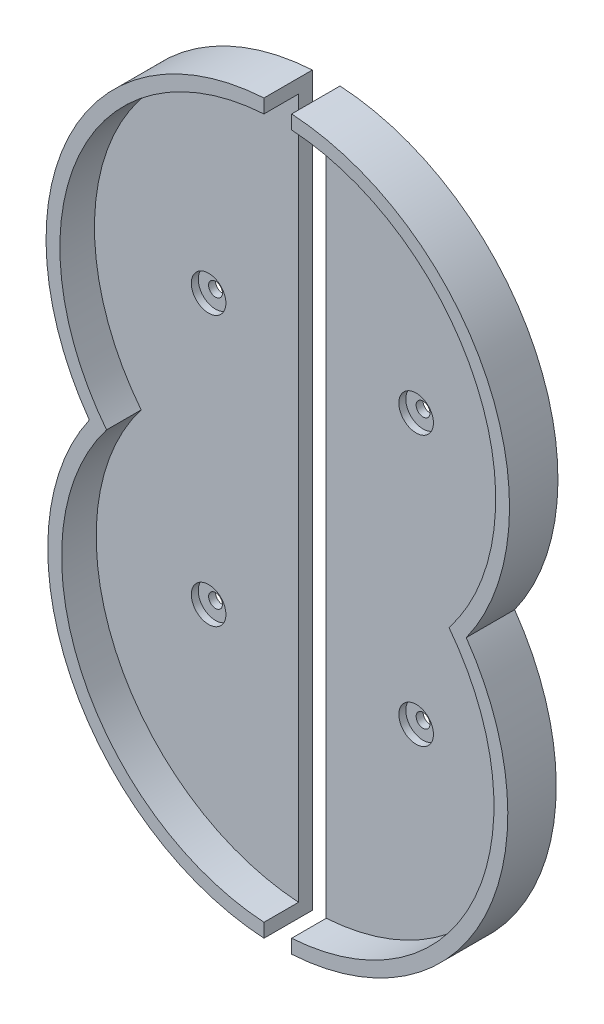
ISO-10303-21;
HEADER;
FILE_DESCRIPTION(('STEP AP214'),'2;1');
FILE_NAME('part.step','',(''),(''),'','','');
FILE_SCHEMA(('AUTOMOTIVE_DESIGN { 1 0 10303 214 1 1 1 1 }'));
ENDSEC;
DATA;
#1=APPLICATION_CONTEXT('core data for automotive mechanical design processes');
#2=APPLICATION_PROTOCOL_DEFINITION('international standard','automotive_design',2000,#1);
#3=PRODUCT_CONTEXT('',#1,'mechanical');
#4=PRODUCT('Part','Part','',(#3));
#5=PRODUCT_RELATED_PRODUCT_CATEGORY('part','',(#4));
#6=PRODUCT_DEFINITION_FORMATION('','',#4);
#7=PRODUCT_DEFINITION_CONTEXT('part definition',#1,'design');
#8=PRODUCT_DEFINITION('design','',#6,#7);
#9=PRODUCT_DEFINITION_SHAPE('','',#8);
#10=(LENGTH_UNIT() NAMED_UNIT(*) SI_UNIT(.MILLI.,.METRE.));
#11=(NAMED_UNIT(*) PLANE_ANGLE_UNIT() SI_UNIT($,.RADIAN.));
#12=(NAMED_UNIT(*) SI_UNIT($,.STERADIAN.) SOLID_ANGLE_UNIT());
#13=UNCERTAINTY_MEASURE_WITH_UNIT(LENGTH_MEASURE(1.E-05),#10,'distance_accuracy_value','');
#14=(GEOMETRIC_REPRESENTATION_CONTEXT(3) GLOBAL_UNCERTAINTY_ASSIGNED_CONTEXT((#13)) GLOBAL_UNIT_ASSIGNED_CONTEXT((#10,
#11,#12)) REPRESENTATION_CONTEXT('',''));
#15=CARTESIAN_POINT('',(0.,0.,0.));
#16=DIRECTION('',(0.,0.,1.));
#17=DIRECTION('',(1.,0.,0.));
#18=AXIS2_PLACEMENT_3D('',#15,#16,#17);
#19=CARTESIAN_POINT('',(30.,-77.9422863405995,2.));
#20=DIRECTION('',(0.,0.,-1.));
#21=DIRECTION('',(-1.,0.,0.));
#22=AXIS2_PLACEMENT_3D('',#19,#20,#21);
#23=CYLINDRICAL_SURFACE('',#22,2.);
#24=CARTESIAN_POINT('',(30.,-77.9422863405995,2.));
#25=DIRECTION('',(0.,0.,1.));
#26=DIRECTION('',(1.,0.,0.));
#27=AXIS2_PLACEMENT_3D('',#24,#25,#26);
#28=CIRCLE('',#27,2.);
#29=CARTESIAN_POINT('',(32.,-77.9422863405995,2.));
#30=VERTEX_POINT('',#29);
#31=EDGE_CURVE('E12',#30,#30,#28,.T.);
#32=ORIENTED_EDGE('',*,*,#31,.T.);
#33=EDGE_LOOP('',(#32));
#34=FACE_BOUND('',#33,.T.);
#35=CARTESIAN_POINT('',(30.,-77.9422863405995,0.));
#36=DIRECTION('',(0.,0.,1.));
#37=DIRECTION('',(1.,0.,0.));
#38=AXIS2_PLACEMENT_3D('',#35,#36,#37);
#39=CIRCLE('',#38,2.);
#40=CARTESIAN_POINT('',(32.,-77.9422863405995,0.));
#41=VERTEX_POINT('',#40);
#42=EDGE_CURVE('E52',#41,#41,#39,.T.);
#43=ORIENTED_EDGE('',*,*,#42,.F.);
#44=EDGE_LOOP('',(#43));
#45=FACE_BOUND('',#44,.T.);
#46=ADVANCED_FACE('F49',(#34,#45),#23,.F.);
#47=CARTESIAN_POINT('',(0.,0.,2.));
#48=DIRECTION('',(0.,0.,1.));
#49=DIRECTION('',(1.,0.,0.));
#50=AXIS2_PLACEMENT_3D('',#47,#48,#49);
#51=PLANE('',#50);
#52=ORIENTED_EDGE('',*,*,#31,.F.);
#53=EDGE_LOOP('',(#52));
#54=FACE_BOUND('',#53,.T.);
#55=CARTESIAN_POINT('',(30.,-77.9422863405995,2.));
#56=DIRECTION('',(0.,0.,1.));
#57=DIRECTION('',(1.,0.,0.));
#58=AXIS2_PLACEMENT_3D('',#55,#56,#57);
#59=CIRCLE('',#58,5.);
#60=CARTESIAN_POINT('',(35.,-77.9422863405995,2.));
#61=VERTEX_POINT('',#60);
#62=EDGE_CURVE('E165',#61,#61,#59,.F.);
#63=ORIENTED_EDGE('',*,*,#62,.F.);
#64=EDGE_LOOP('',(#63));
#65=FACE_BOUND('',#64,.T.);
#66=ADVANCED_FACE('F177',(#54,#65),#51,.T.);
#67=CARTESIAN_POINT('',(0.,0.,0.));
#68=DIRECTION('',(0.,0.,1.));
#69=DIRECTION('',(1.,0.,0.));
#70=AXIS2_PLACEMENT_3D('',#67,#68,#69);
#71=PLANE('',#70);
#72=DIRECTION('',(0.,-1.,0.));
#73=VECTOR('',#72,1.);
#74=CARTESIAN_POINT('',(3.99999999999997,0.,0.));
#75=LINE('',#74,#73);
#76=CARTESIAN_POINT('',(3.99999999999996,66.8804904288239,0.));
#77=VERTEX_POINT('',#76);
#78=CARTESIAN_POINT('',(4.00000000000001,-143.510733407058,0.));
#79=VERTEX_POINT('',#78);
#80=EDGE_CURVE('E132',#77,#79,#75,.T.);
#81=ORIENTED_EDGE('',*,*,#80,.F.);
#82=CARTESIAN_POINT('',(0.,0.,0.));
#83=DIRECTION('',(0.,0.,1.));
#84=DIRECTION('',(1.,0.,0.));
#85=AXIS2_PLACEMENT_3D('',#82,#83,#84);
#86=CIRCLE('',#85,67.);
#87=CARTESIAN_POINT('',(54.4805878735252,-38.9982761792761,0.));
#88=VERTEX_POINT('',#87);
#89=EDGE_CURVE('E127',#88,#77,#86,.T.);
#90=ORIENTED_EDGE('',*,*,#89,.F.);
#91=CARTESIAN_POINT('',(0.,-77.1311431702997,0.));
#92=DIRECTION('',(0.,0.,1.));
#93=DIRECTION('',(1.,0.,0.));
#94=AXIS2_PLACEMENT_3D('',#91,#92,#93);
#95=CIRCLE('',#94,66.5);
#96=EDGE_CURVE('E388',#79,#88,#95,.T.);
#97=ORIENTED_EDGE('',*,*,#96,.F.);
#98=EDGE_LOOP('',(#81,#90,#97));
#99=FACE_BOUND('',#98,.T.);
#100=ORIENTED_EDGE('',*,*,#42,.T.);
#101=EDGE_LOOP('',(#100));
#102=FACE_BOUND('',#101,.T.);
#103=CARTESIAN_POINT('',(30.,0.,0.));
#104=DIRECTION('',(0.,0.,1.));
#105=DIRECTION('',(1.,0.,0.));
#106=AXIS2_PLACEMENT_3D('',#103,#104,#105);
#107=CIRCLE('',#106,2.);
#108=CARTESIAN_POINT('',(32.,0.,0.));
#109=VERTEX_POINT('',#108);
#110=EDGE_CURVE('E134',#109,#109,#107,.F.);
#111=ORIENTED_EDGE('',*,*,#110,.F.);
#112=EDGE_LOOP('',(#111));
#113=FACE_BOUND('',#112,.T.);
#114=ADVANCED_FACE('F173',(#99,#102,#113),#71,.F.);
#115=CARTESIAN_POINT('',(3.99999999999997,0.,4.));
#116=DIRECTION('',(1.,0.,0.));
#117=DIRECTION('',(0.,1.,0.));
#118=AXIS2_PLACEMENT_3D('',#115,#116,#117);
#119=PLANE('',#118);
#120=ORIENTED_EDGE('',*,*,#80,.T.);
#121=DIRECTION('',(0.,0.,-1.));
#122=VECTOR('',#121,1.);
#123=CARTESIAN_POINT('',(4.00000000000001,-143.510733407058,14.));
#124=LINE('',#123,#122);
#125=CARTESIAN_POINT('',(4.00000000000001,-143.510733407058,14.));
#126=VERTEX_POINT('',#125);
#127=EDGE_CURVE('E112',#126,#79,#124,.T.);
#128=ORIENTED_EDGE('',*,*,#127,.F.);
#129=DIRECTION('',(0.,-1.,0.));
#130=VECTOR('',#129,1.);
#131=CARTESIAN_POINT('',(3.99999999999997,0.,14.));
#132=LINE('',#131,#130);
#133=CARTESIAN_POINT('',(4.00000000000001,-139.503011829175,14.));
#134=VERTEX_POINT('',#133);
#135=EDGE_CURVE('E118',#134,#126,#132,.T.);
#136=ORIENTED_EDGE('',*,*,#135,.F.);
#137=DIRECTION('',(0.,0.,-1.));
#138=VECTOR('',#137,1.);
#139=CARTESIAN_POINT('',(4.00000000000001,-139.503011829175,14.));
#140=LINE('',#139,#138);
#141=CARTESIAN_POINT('',(4.00000000000001,-139.503011829175,4.));
#142=VERTEX_POINT('',#141);
#143=EDGE_CURVE('E377',#134,#142,#140,.T.);
#144=ORIENTED_EDGE('',*,*,#143,.T.);
#145=DIRECTION('',(0.,-1.,0.));
#146=VECTOR('',#145,1.);
#147=CARTESIAN_POINT('',(3.99999999999997,0.,4.));
#148=LINE('',#147,#146);
#149=CARTESIAN_POINT('',(3.99999999999996,62.8728876384726,4.));
#150=VERTEX_POINT('',#149);
#151=EDGE_CURVE('E153',#150,#142,#148,.T.);
#152=ORIENTED_EDGE('',*,*,#151,.F.);
#153=DIRECTION('',(0.,0.,-1.));
#154=VECTOR('',#153,1.);
#155=CARTESIAN_POINT('',(3.99999999999996,62.8728876384726,14.));
#156=LINE('',#155,#154);
#157=CARTESIAN_POINT('',(3.99999999999996,62.8728876384726,14.));
#158=VERTEX_POINT('',#157);
#159=EDGE_CURVE('E71',#158,#150,#156,.T.);
#160=ORIENTED_EDGE('',*,*,#159,.F.);
#161=CARTESIAN_POINT('',(3.99999999999996,66.8804904288239,14.));
#162=VERTEX_POINT('',#161);
#163=EDGE_CURVE('E129',#162,#158,#132,.T.);
#164=ORIENTED_EDGE('',*,*,#163,.F.);
#165=DIRECTION('',(0.,0.,-1.));
#166=VECTOR('',#165,1.);
#167=CARTESIAN_POINT('',(3.99999999999996,66.8804904288239,14.));
#168=LINE('',#167,#166);
#169=EDGE_CURVE('E139',#162,#77,#168,.T.);
#170=ORIENTED_EDGE('',*,*,#169,.T.);
#171=EDGE_LOOP('',(#120,#128,#136,#144,#152,#160,#164,#170));
#172=FACE_BOUND('',#171,.T.);
#173=ADVANCED_FACE('F130',(#172),#119,.F.);
#174=CARTESIAN_POINT('',(30.,0.,4.));
#175=DIRECTION('',(0.,0.,-1.));
#176=DIRECTION('',(-1.,0.,0.));
#177=AXIS2_PLACEMENT_3D('',#174,#175,#176);
#178=CYLINDRICAL_SURFACE('',#177,5.);
#179=CARTESIAN_POINT('',(30.,0.,2.));
#180=DIRECTION('',(0.,0.,1.));
#181=DIRECTION('',(1.,0.,0.));
#182=AXIS2_PLACEMENT_3D('',#179,#180,#181);
#183=CIRCLE('',#182,5.);
#184=CARTESIAN_POINT('',(35.,0.,2.));
#185=VERTEX_POINT('',#184);
#186=EDGE_CURVE('E137',#185,#185,#183,.F.);
#187=ORIENTED_EDGE('',*,*,#186,.T.);
#188=EDGE_LOOP('',(#187));
#189=FACE_BOUND('',#188,.T.);
#190=CARTESIAN_POINT('',(30.,0.,4.));
#191=DIRECTION('',(0.,0.,1.));
#192=DIRECTION('',(1.,0.,0.));
#193=AXIS2_PLACEMENT_3D('',#190,#191,#192);
#194=CIRCLE('',#193,5.);
#195=CARTESIAN_POINT('',(35.,0.,4.));
#196=VERTEX_POINT('',#195);
#197=EDGE_CURVE('E159',#196,#196,#194,.F.);
#198=ORIENTED_EDGE('',*,*,#197,.F.);
#199=EDGE_LOOP('',(#198));
#200=FACE_BOUND('',#199,.T.);
#201=ADVANCED_FACE('F193',(#189,#200),#178,.F.);
#202=CARTESIAN_POINT('',(30.,-77.9422863405995,4.));
#203=DIRECTION('',(0.,0.,-1.));
#204=DIRECTION('',(-1.,0.,0.));
#205=AXIS2_PLACEMENT_3D('',#202,#203,#204);
#206=CYLINDRICAL_SURFACE('',#205,5.);
#207=ORIENTED_EDGE('',*,*,#62,.T.);
#208=EDGE_LOOP('',(#207));
#209=FACE_BOUND('',#208,.T.);
#210=CARTESIAN_POINT('',(30.,-77.9422863405995,4.));
#211=DIRECTION('',(0.,0.,1.));
#212=DIRECTION('',(1.,0.,0.));
#213=AXIS2_PLACEMENT_3D('',#210,#211,#212);
#214=CIRCLE('',#213,5.);
#215=CARTESIAN_POINT('',(35.,-77.9422863405995,4.));
#216=VERTEX_POINT('',#215);
#217=EDGE_CURVE('E162',#216,#216,#214,.T.);
#218=ORIENTED_EDGE('',*,*,#217,.T.);
#219=EDGE_LOOP('',(#218));
#220=FACE_BOUND('',#219,.T.);
#221=ADVANCED_FACE('F196',(#209,#220),#206,.F.);
#222=CARTESIAN_POINT('',(0.,0.,4.));
#223=DIRECTION('',(0.,0.,1.));
#224=DIRECTION('',(1.,0.,0.));
#225=AXIS2_PLACEMENT_3D('',#222,#223,#224);
#226=PLANE('',#225);
#227=DIRECTION('',(1.,3.7011718080398E-12,0.));
#228=VECTOR('',#227,1.);
#229=CARTESIAN_POINT('',(1.44238896429674E-10,-38.971143170483,4.));
#230=LINE('',#229,#228);
#231=CARTESIAN_POINT('',(49.4981252170221,-38.9711431702998,4.));
#232=VERTEX_POINT('',#231);
#233=CARTESIAN_POINT('',(49.5,-38.9711431702997,4.));
#234=VERTEX_POINT('',#233);
#235=EDGE_CURVE('E148',#232,#234,#230,.T.);
#236=ORIENTED_EDGE('',*,*,#235,.T.);
#237=CARTESIAN_POINT('',(0.,0.,4.));
#238=DIRECTION('',(0.,0.,1.));
#239=DIRECTION('',(1.,0.,0.));
#240=AXIS2_PLACEMENT_3D('',#237,#238,#239);
#241=CIRCLE('',#240,63.);
#242=EDGE_CURVE('E151',#234,#150,#241,.T.);
#243=ORIENTED_EDGE('',*,*,#242,.T.);
#244=ORIENTED_EDGE('',*,*,#151,.T.);
#245=CARTESIAN_POINT('',(0.,-77.1311431702997,4.));
#246=DIRECTION('',(0.,0.,1.));
#247=DIRECTION('',(1.,0.,0.));
#248=AXIS2_PLACEMENT_3D('',#245,#246,#247);
#249=CIRCLE('',#248,62.5);
#250=EDGE_CURVE('E156',#142,#232,#249,.T.);
#251=ORIENTED_EDGE('',*,*,#250,.T.);
#252=EDGE_LOOP('',(#236,#243,#244,#251));
#253=FACE_BOUND('',#252,.T.);
#254=ORIENTED_EDGE('',*,*,#197,.T.);
#255=EDGE_LOOP('',(#254));
#256=FACE_BOUND('',#255,.T.);
#257=ORIENTED_EDGE('',*,*,#217,.F.);
#258=EDGE_LOOP('',(#257));
#259=FACE_BOUND('',#258,.T.);
#260=ADVANCED_FACE('F200',(#253,#256,#259),#226,.T.);
#261=CARTESIAN_POINT('',(30.,0.,2.));
#262=DIRECTION('',(0.,0.,-1.));
#263=DIRECTION('',(-1.,0.,0.));
#264=AXIS2_PLACEMENT_3D('',#261,#262,#263);
#265=CYLINDRICAL_SURFACE('',#264,2.);
#266=CARTESIAN_POINT('',(30.,0.,2.));
#267=DIRECTION('',(0.,0.,1.));
#268=DIRECTION('',(1.,0.,0.));
#269=AXIS2_PLACEMENT_3D('',#266,#267,#268);
#270=CIRCLE('',#269,2.);
#271=CARTESIAN_POINT('',(32.,0.,2.));
#272=VERTEX_POINT('',#271);
#273=EDGE_CURVE('E145',#272,#272,#270,.F.);
#274=ORIENTED_EDGE('',*,*,#273,.F.);
#275=EDGE_LOOP('',(#274));
#276=FACE_BOUND('',#275,.T.);
#277=ORIENTED_EDGE('',*,*,#110,.T.);
#278=EDGE_LOOP('',(#277));
#279=FACE_BOUND('',#278,.T.);
#280=ADVANCED_FACE('F203',(#276,#279),#265,.F.);
#281=CARTESIAN_POINT('',(0.,0.,2.));
#282=DIRECTION('',(0.,0.,1.));
#283=DIRECTION('',(1.,0.,0.));
#284=AXIS2_PLACEMENT_3D('',#281,#282,#283);
#285=PLANE('',#284);
#286=ORIENTED_EDGE('',*,*,#186,.F.);
#287=EDGE_LOOP('',(#286));
#288=FACE_BOUND('',#287,.T.);
#289=ORIENTED_EDGE('',*,*,#273,.T.);
#290=EDGE_LOOP('',(#289));
#291=FACE_BOUND('',#290,.T.);
#292=ADVANCED_FACE('F207',(#288,#291),#285,.T.);
#293=CARTESIAN_POINT('',(0.,-77.1311431702997,14.));
#294=DIRECTION('',(0.,0.,-1.));
#295=DIRECTION('',(-1.,0.,0.));
#296=AXIS2_PLACEMENT_3D('',#293,#294,#295);
#297=CYLINDRICAL_SURFACE('',#296,66.5);
#298=ORIENTED_EDGE('',*,*,#96,.T.);
#299=DIRECTION('',(0.,0.,-1.));
#300=VECTOR('',#299,1.);
#301=CARTESIAN_POINT('',(54.4805878735252,-38.9982761792761,14.));
#302=LINE('',#301,#300);
#303=CARTESIAN_POINT('',(54.4805878735252,-38.9982761792761,14.));
#304=VERTEX_POINT('',#303);
#305=EDGE_CURVE('E114',#304,#88,#302,.T.);
#306=ORIENTED_EDGE('',*,*,#305,.F.);
#307=CARTESIAN_POINT('',(0.,-77.1311431702997,14.));
#308=DIRECTION('',(0.,0.,1.));
#309=DIRECTION('',(1.,0.,0.));
#310=AXIS2_PLACEMENT_3D('',#307,#308,#309);
#311=CIRCLE('',#310,66.5);
#312=EDGE_CURVE('E108',#126,#304,#311,.T.);
#313=ORIENTED_EDGE('',*,*,#312,.F.);
#314=ORIENTED_EDGE('',*,*,#127,.T.);
#315=EDGE_LOOP('',(#298,#306,#313,#314));
#316=FACE_BOUND('',#315,.T.);
#317=ADVANCED_FACE('F110',(#316),#297,.T.);
#318=CARTESIAN_POINT('',(0.,0.,14.));
#319=DIRECTION('',(0.,0.,-1.));
#320=DIRECTION('',(-1.,0.,0.));
#321=AXIS2_PLACEMENT_3D('',#318,#319,#320);
#322=CYLINDRICAL_SURFACE('',#321,67.);
#323=ORIENTED_EDGE('',*,*,#89,.T.);
#324=ORIENTED_EDGE('',*,*,#169,.F.);
#325=CARTESIAN_POINT('',(0.,0.,14.));
#326=DIRECTION('',(0.,0.,1.));
#327=DIRECTION('',(1.,0.,0.));
#328=AXIS2_PLACEMENT_3D('',#325,#326,#327);
#329=CIRCLE('',#328,67.);
#330=EDGE_CURVE('E117',#304,#162,#329,.T.);
#331=ORIENTED_EDGE('',*,*,#330,.F.);
#332=ORIENTED_EDGE('',*,*,#305,.T.);
#333=EDGE_LOOP('',(#323,#324,#331,#332));
#334=FACE_BOUND('',#333,.T.);
#335=ADVANCED_FACE('F214',(#334),#322,.T.);
#336=CARTESIAN_POINT('',(0.,0.,14.));
#337=DIRECTION('',(0.,0.,-1.));
#338=DIRECTION('',(-1.,0.,0.));
#339=AXIS2_PLACEMENT_3D('',#336,#337,#338);
#340=CYLINDRICAL_SURFACE('',#339,63.);
#341=ORIENTED_EDGE('',*,*,#159,.T.);
#342=ORIENTED_EDGE('',*,*,#242,.F.);
#343=DIRECTION('',(0.,0.,-1.));
#344=VECTOR('',#343,1.);
#345=CARTESIAN_POINT('',(49.5,-38.9711431702997,14.));
#346=LINE('',#345,#344);
#347=CARTESIAN_POINT('',(49.5,-38.9711431702997,14.));
#348=VERTEX_POINT('',#347);
#349=EDGE_CURVE('E371',#348,#234,#346,.T.);
#350=ORIENTED_EDGE('',*,*,#349,.F.);
#351=CARTESIAN_POINT('',(0.,0.,14.));
#352=DIRECTION('',(0.,0.,1.));
#353=DIRECTION('',(1.,0.,0.));
#354=AXIS2_PLACEMENT_3D('',#351,#352,#353);
#355=CIRCLE('',#354,63.);
#356=EDGE_CURVE('E391',#348,#158,#355,.T.);
#357=ORIENTED_EDGE('',*,*,#356,.T.);
#358=EDGE_LOOP('',(#341,#342,#350,#357));
#359=FACE_BOUND('',#358,.T.);
#360=ADVANCED_FACE('F217',(#359),#340,.F.);
#361=CARTESIAN_POINT('',(1.44238896429674E-10,-38.971143170483,14.));
#362=DIRECTION('',(-3.7011718080398E-12,1.,0.));
#363=DIRECTION('',(-1.,-3.7011718080398E-12,0.));
#364=AXIS2_PLACEMENT_3D('',#361,#362,#363);
#365=PLANE('',#364);
#366=ORIENTED_EDGE('',*,*,#349,.T.);
#367=ORIENTED_EDGE('',*,*,#235,.F.);
#368=DIRECTION('',(0.,0.,-1.));
#369=VECTOR('',#368,1.);
#370=CARTESIAN_POINT('',(49.4981252170221,-38.9711431702998,14.));
#371=LINE('',#370,#369);
#372=CARTESIAN_POINT('',(49.4981252170221,-38.9711431702998,14.));
#373=VERTEX_POINT('',#372);
#374=EDGE_CURVE('E63',#373,#232,#371,.T.);
#375=ORIENTED_EDGE('',*,*,#374,.F.);
#376=DIRECTION('',(1.,3.7011718080398E-12,0.));
#377=VECTOR('',#376,1.);
#378=CARTESIAN_POINT('',(1.44238896429674E-10,-38.971143170483,14.));
#379=LINE('',#378,#377);
#380=EDGE_CURVE('E372',#373,#348,#379,.T.);
#381=ORIENTED_EDGE('',*,*,#380,.T.);
#382=EDGE_LOOP('',(#366,#367,#375,#381));
#383=FACE_BOUND('',#382,.T.);
#384=ADVANCED_FACE('F221',(#383),#365,.T.);
#385=CARTESIAN_POINT('',(0.,-77.1311431702997,14.));
#386=DIRECTION('',(0.,0.,-1.));
#387=DIRECTION('',(-1.,0.,0.));
#388=AXIS2_PLACEMENT_3D('',#385,#386,#387);
#389=CYLINDRICAL_SURFACE('',#388,62.5);
#390=ORIENTED_EDGE('',*,*,#374,.T.);
#391=ORIENTED_EDGE('',*,*,#250,.F.);
#392=ORIENTED_EDGE('',*,*,#143,.F.);
#393=CARTESIAN_POINT('',(0.,-77.1311431702997,14.));
#394=DIRECTION('',(0.,0.,1.));
#395=DIRECTION('',(1.,0.,0.));
#396=AXIS2_PLACEMENT_3D('',#393,#394,#395);
#397=CIRCLE('',#396,62.5);
#398=EDGE_CURVE('E124',#134,#373,#397,.T.);
#399=ORIENTED_EDGE('',*,*,#398,.T.);
#400=EDGE_LOOP('',(#390,#391,#392,#399));
#401=FACE_BOUND('',#400,.T.);
#402=ADVANCED_FACE('F224',(#401),#389,.F.);
#403=CARTESIAN_POINT('',(0.,0.,14.));
#404=DIRECTION('',(0.,0.,1.));
#405=DIRECTION('',(1.,0.,0.));
#406=AXIS2_PLACEMENT_3D('',#403,#404,#405);
#407=PLANE('',#406);
#408=ORIENTED_EDGE('',*,*,#135,.T.);
#409=ORIENTED_EDGE('',*,*,#312,.T.);
#410=ORIENTED_EDGE('',*,*,#330,.T.);
#411=ORIENTED_EDGE('',*,*,#163,.T.);
#412=ORIENTED_EDGE('',*,*,#356,.F.);
#413=ORIENTED_EDGE('',*,*,#380,.F.);
#414=ORIENTED_EDGE('',*,*,#398,.F.);
#415=EDGE_LOOP('',(#408,#409,#410,#411,#412,#413,#414));
#416=FACE_BOUND('',#415,.T.);
#417=ADVANCED_FACE('F122',(#416),#407,.T.);
#418=CLOSED_SHELL('',(#46,#66,#114,#173,#201,#221,#260,#280,#292,#317,#335,#360,#384,#402,#417));
#419=MANIFOLD_SOLID_BREP('B2',#418);
#420=CARTESIAN_POINT('',(-3.99999999999999,0.,4.));
#421=DIRECTION('',(1.,0.,0.));
#422=DIRECTION('',(0.,0.,-1.));
#423=AXIS2_PLACEMENT_3D('',#420,#421,#422);
#424=PLANE('',#423);
#425=DIRECTION('',(0.,-1.,0.));
#426=VECTOR('',#425,1.);
#427=CARTESIAN_POINT('',(-3.99999999999999,0.,0.));
#428=LINE('',#427,#426);
#429=CARTESIAN_POINT('',(-3.99999999999999,66.8804904288239,0.));
#430=VERTEX_POINT('',#429);
#431=CARTESIAN_POINT('',(-3.99999999999999,-143.510733407058,0.));
#432=VERTEX_POINT('',#431);
#433=EDGE_CURVE('E509',#430,#432,#428,.T.);
#434=ORIENTED_EDGE('',*,*,#433,.F.);
#435=DIRECTION('',(0.,0.,-1.));
#436=VECTOR('',#435,1.);
#437=CARTESIAN_POINT('',(-3.99999999999999,66.8804904288239,14.));
#438=LINE('',#437,#436);
#439=CARTESIAN_POINT('',(-3.99999999999999,66.8804904288239,14.));
#440=VERTEX_POINT('',#439);
#441=EDGE_CURVE('E530',#440,#430,#438,.T.);
#442=ORIENTED_EDGE('',*,*,#441,.F.);
#443=DIRECTION('',(0.,-1.,0.));
#444=VECTOR('',#443,1.);
#445=CARTESIAN_POINT('',(-3.99999999999999,0.,14.));
#446=LINE('',#445,#444);
#447=CARTESIAN_POINT('',(-3.99999999999999,62.8728876384726,14.));
#448=VERTEX_POINT('',#447);
#449=EDGE_CURVE('E483',#440,#448,#446,.T.);
#450=ORIENTED_EDGE('',*,*,#449,.T.);
#451=DIRECTION('',(0.,0.,-1.));
#452=VECTOR('',#451,1.);
#453=CARTESIAN_POINT('',(-3.99999999999999,62.8728876384726,14.));
#454=LINE('',#453,#452);
#455=CARTESIAN_POINT('',(-3.99999999999999,62.8728876384726,4.));
#456=VERTEX_POINT('',#455);
#457=EDGE_CURVE('E532',#448,#456,#454,.T.);
#458=ORIENTED_EDGE('',*,*,#457,.T.);
#459=DIRECTION('',(0.,-1.,0.));
#460=VECTOR('',#459,1.);
#461=CARTESIAN_POINT('',(-3.99999999999999,0.,4.));
#462=LINE('',#461,#460);
#463=CARTESIAN_POINT('',(-3.99999999999999,-139.503011829175,4.));
#464=VERTEX_POINT('',#463);
#465=EDGE_CURVE('E515',#456,#464,#462,.T.);
#466=ORIENTED_EDGE('',*,*,#465,.T.);
#467=DIRECTION('',(0.,0.,-1.));
#468=VECTOR('',#467,1.);
#469=CARTESIAN_POINT('',(-3.99999999999999,-139.503011829175,14.));
#470=LINE('',#469,#468);
#471=CARTESIAN_POINT('',(-3.99999999999999,-139.503011829175,14.));
#472=VERTEX_POINT('',#471);
#473=EDGE_CURVE('E496',#472,#464,#470,.T.);
#474=ORIENTED_EDGE('',*,*,#473,.F.);
#475=CARTESIAN_POINT('',(-3.99999999999999,-143.510733407058,14.));
#476=VERTEX_POINT('',#475);
#477=EDGE_CURVE('E475',#472,#476,#446,.T.);
#478=ORIENTED_EDGE('',*,*,#477,.T.);
#479=DIRECTION('',(0.,0.,-1.));
#480=VECTOR('',#479,1.);
#481=CARTESIAN_POINT('',(-3.99999999999999,-143.510733407058,14.));
#482=LINE('',#481,#480);
#483=EDGE_CURVE('E471',#476,#432,#482,.T.);
#484=ORIENTED_EDGE('',*,*,#483,.T.);
#485=EDGE_LOOP('',(#434,#442,#450,#458,#466,#474,#478,#484));
#486=FACE_BOUND('',#485,.T.);
#487=ADVANCED_FACE('F406',(#486),#424,.T.);
#488=CARTESIAN_POINT('',(-30.,0.,4.));
#489=DIRECTION('',(0.,0.,-1.));
#490=DIRECTION('',(-1.,0.,0.));
#491=AXIS2_PLACEMENT_3D('',#488,#489,#490);
#492=CYLINDRICAL_SURFACE('',#491,5.);
#493=CARTESIAN_POINT('',(-30.,0.,2.));
#494=DIRECTION('',(0.,0.,1.));
#495=DIRECTION('',(1.,0.,0.));
#496=AXIS2_PLACEMENT_3D('',#493,#494,#495);
#497=CIRCLE('',#496,5.);
#498=CARTESIAN_POINT('',(-25.,0.,2.));
#499=VERTEX_POINT('',#498);
#500=EDGE_CURVE('E47',#499,#499,#497,.T.);
#501=ORIENTED_EDGE('',*,*,#500,.F.);
#502=EDGE_LOOP('',(#501));
#503=FACE_BOUND('',#502,.T.);
#504=CARTESIAN_POINT('',(-30.,0.,4.));
#505=DIRECTION('',(0.,0.,1.));
#506=DIRECTION('',(1.,0.,0.));
#507=AXIS2_PLACEMENT_3D('',#504,#505,#506);
#508=CIRCLE('',#507,5.);
#509=CARTESIAN_POINT('',(-25.,0.,4.));
#510=VERTEX_POINT('',#509);
#511=EDGE_CURVE('E512',#510,#510,#508,.T.);
#512=ORIENTED_EDGE('',*,*,#511,.T.);
#513=EDGE_LOOP('',(#512));
#514=FACE_BOUND('',#513,.T.);
#515=ADVANCED_FACE('F408',(#503,#514),#492,.F.);
#516=CARTESIAN_POINT('',(-30.,-77.9422863405995,4.));
#517=DIRECTION('',(0.,0.,-1.));
#518=DIRECTION('',(-1.,0.,0.));
#519=AXIS2_PLACEMENT_3D('',#516,#517,#518);
#520=CYLINDRICAL_SURFACE('',#519,5.);
#521=CARTESIAN_POINT('',(-30.,-77.9422863405995,2.));
#522=DIRECTION('',(0.,0.,1.));
#523=DIRECTION('',(1.,0.,0.));
#524=AXIS2_PLACEMENT_3D('',#521,#522,#523);
#525=CIRCLE('',#524,5.);
#526=CARTESIAN_POINT('',(-25.,-77.9422863405995,2.));
#527=VERTEX_POINT('',#526);
#528=EDGE_CURVE('E494',#527,#527,#525,.F.);
#529=ORIENTED_EDGE('',*,*,#528,.T.);
#530=EDGE_LOOP('',(#529));
#531=FACE_BOUND('',#530,.T.);
#532=CARTESIAN_POINT('',(-30.,-77.9422863405995,4.));
#533=DIRECTION('',(0.,0.,1.));
#534=DIRECTION('',(1.,0.,0.));
#535=AXIS2_PLACEMENT_3D('',#532,#533,#534);
#536=CIRCLE('',#535,5.);
#537=CARTESIAN_POINT('',(-25.,-77.9422863405995,4.));
#538=VERTEX_POINT('',#537);
#539=EDGE_CURVE('E414',#538,#538,#536,.F.);
#540=ORIENTED_EDGE('',*,*,#539,.F.);
#541=EDGE_LOOP('',(#540));
#542=FACE_BOUND('',#541,.T.);
#543=ADVANCED_FACE('F562',(#531,#542),#520,.F.);
#544=CARTESIAN_POINT('',(0.,0.,4.));
#545=DIRECTION('',(0.,0.,1.));
#546=DIRECTION('',(1.,0.,0.));
#547=AXIS2_PLACEMENT_3D('',#544,#545,#546);
#548=PLANE('',#547);
#549=ORIENTED_EDGE('',*,*,#511,.F.);
#550=EDGE_LOOP('',(#549));
#551=FACE_BOUND('',#550,.T.);
#552=ORIENTED_EDGE('',*,*,#465,.F.);
#553=CARTESIAN_POINT('',(0.,0.,4.));
#554=DIRECTION('',(0.,0.,1.));
#555=DIRECTION('',(1.,0.,0.));
#556=AXIS2_PLACEMENT_3D('',#553,#554,#555);
#557=CIRCLE('',#556,63.);
#558=CARTESIAN_POINT('',(-49.5,-38.9711431702997,4.));
#559=VERTEX_POINT('',#558);
#560=EDGE_CURVE('E517',#456,#559,#557,.T.);
#561=ORIENTED_EDGE('',*,*,#560,.T.);
#562=DIRECTION('',(1.,-3.7011718080672E-12,0.));
#563=VECTOR('',#562,1.);
#564=CARTESIAN_POINT('',(-1.44238896430742E-10,-38.971143170483,4.));
#565=LINE('',#564,#563);
#566=CARTESIAN_POINT('',(-49.4981252170221,-38.9711431702998,4.));
#567=VERTEX_POINT('',#566);
#568=EDGE_CURVE('E426',#559,#567,#565,.T.);
#569=ORIENTED_EDGE('',*,*,#568,.T.);
#570=CARTESIAN_POINT('',(0.,-77.1311431702997,4.));
#571=DIRECTION('',(0.,0.,1.));
#572=DIRECTION('',(1.,0.,0.));
#573=AXIS2_PLACEMENT_3D('',#570,#571,#572);
#574=CIRCLE('',#573,62.5);
#575=EDGE_CURVE('E421',#567,#464,#574,.T.);
#576=ORIENTED_EDGE('',*,*,#575,.T.);
#577=EDGE_LOOP('',(#552,#561,#569,#576));
#578=FACE_BOUND('',#577,.T.);
#579=ORIENTED_EDGE('',*,*,#539,.T.);
#580=EDGE_LOOP('',(#579));
#581=FACE_BOUND('',#580,.T.);
#582=ADVANCED_FACE('F559',(#551,#578,#581),#548,.T.);
#583=CARTESIAN_POINT('',(0.,0.,0.));
#584=DIRECTION('',(0.,0.,1.));
#585=DIRECTION('',(1.,0.,0.));
#586=AXIS2_PLACEMENT_3D('',#583,#584,#585);
#587=PLANE('',#586);
#588=ORIENTED_EDGE('',*,*,#433,.T.);
#589=CARTESIAN_POINT('',(0.,-77.1311431702997,0.));
#590=DIRECTION('',(0.,0.,1.));
#591=DIRECTION('',(1.,0.,0.));
#592=AXIS2_PLACEMENT_3D('',#589,#590,#591);
#593=CIRCLE('',#592,66.5);
#594=CARTESIAN_POINT('',(-54.4805878735252,-38.9982761792761,0.));
#595=VERTEX_POINT('',#594);
#596=EDGE_CURVE('E486',#595,#432,#593,.T.);
#597=ORIENTED_EDGE('',*,*,#596,.F.);
#598=CARTESIAN_POINT('',(0.,0.,0.));
#599=DIRECTION('',(0.,0.,1.));
#600=DIRECTION('',(1.,0.,0.));
#601=AXIS2_PLACEMENT_3D('',#598,#599,#600);
#602=CIRCLE('',#601,67.);
#603=EDGE_CURVE('E490',#430,#595,#602,.T.);
#604=ORIENTED_EDGE('',*,*,#603,.F.);
#605=EDGE_LOOP('',(#588,#597,#604));
#606=FACE_BOUND('',#605,.T.);
#607=CARTESIAN_POINT('',(-30.,0.,0.));
#608=DIRECTION('',(0.,0.,1.));
#609=DIRECTION('',(1.,0.,0.));
#610=AXIS2_PLACEMENT_3D('',#607,#608,#609);
#611=CIRCLE('',#610,2.);
#612=CARTESIAN_POINT('',(-28.,0.,0.));
#613=VERTEX_POINT('',#612);
#614=EDGE_CURVE('E504',#613,#613,#611,.T.);
#615=ORIENTED_EDGE('',*,*,#614,.T.);
#616=EDGE_LOOP('',(#615));
#617=FACE_BOUND('',#616,.T.);
#618=CARTESIAN_POINT('',(-30.,-77.9422863405995,0.));
#619=DIRECTION('',(0.,0.,1.));
#620=DIRECTION('',(1.,0.,0.));
#621=AXIS2_PLACEMENT_3D('',#618,#619,#620);
#622=CIRCLE('',#621,2.);
#623=CARTESIAN_POINT('',(-28.,-77.9422863405995,0.));
#624=VERTEX_POINT('',#623);
#625=EDGE_CURVE('E491',#624,#624,#622,.F.);
#626=ORIENTED_EDGE('',*,*,#625,.F.);
#627=EDGE_LOOP('',(#626));
#628=FACE_BOUND('',#627,.T.);
#629=ADVANCED_FACE('F523',(#606,#617,#628),#587,.F.);
#630=CARTESIAN_POINT('',(-30.,0.,2.));
#631=DIRECTION('',(0.,0.,-1.));
#632=DIRECTION('',(-1.,0.,0.));
#633=AXIS2_PLACEMENT_3D('',#630,#631,#632);
#634=CYLINDRICAL_SURFACE('',#633,2.);
#635=CARTESIAN_POINT('',(-30.,0.,2.));
#636=DIRECTION('',(0.,0.,1.));
#637=DIRECTION('',(1.,0.,0.));
#638=AXIS2_PLACEMENT_3D('',#635,#636,#637);
#639=CIRCLE('',#638,2.);
#640=CARTESIAN_POINT('',(-28.,0.,2.));
#641=VERTEX_POINT('',#640);
#642=EDGE_CURVE('E506',#641,#641,#639,.T.);
#643=ORIENTED_EDGE('',*,*,#642,.T.);
#644=EDGE_LOOP('',(#643));
#645=FACE_BOUND('',#644,.T.);
#646=ORIENTED_EDGE('',*,*,#614,.F.);
#647=EDGE_LOOP('',(#646));
#648=FACE_BOUND('',#647,.T.);
#649=ADVANCED_FACE('F597',(#645,#648),#634,.F.);
#650=CARTESIAN_POINT('',(0.,0.,2.));
#651=DIRECTION('',(0.,0.,1.));
#652=DIRECTION('',(1.,0.,0.));
#653=AXIS2_PLACEMENT_3D('',#650,#651,#652);
#654=PLANE('',#653);
#655=ORIENTED_EDGE('',*,*,#642,.F.);
#656=EDGE_LOOP('',(#655));
#657=FACE_BOUND('',#656,.T.);
#658=ORIENTED_EDGE('',*,*,#500,.T.);
#659=EDGE_LOOP('',(#658));
#660=FACE_BOUND('',#659,.T.);
#661=ADVANCED_FACE('F602',(#657,#660),#654,.T.);
#662=CARTESIAN_POINT('',(-30.,-77.9422863405995,2.));
#663=DIRECTION('',(0.,0.,-1.));
#664=DIRECTION('',(-1.,0.,0.));
#665=AXIS2_PLACEMENT_3D('',#662,#663,#664);
#666=CYLINDRICAL_SURFACE('',#665,2.);
#667=CARTESIAN_POINT('',(-30.,-77.9422863405995,2.));
#668=DIRECTION('',(0.,0.,1.));
#669=DIRECTION('',(1.,0.,0.));
#670=AXIS2_PLACEMENT_3D('',#667,#668,#669);
#671=CIRCLE('',#670,2.);
#672=CARTESIAN_POINT('',(-28.,-77.9422863405995,2.));
#673=VERTEX_POINT('',#672);
#674=EDGE_CURVE('E502',#673,#673,#671,.F.);
#675=ORIENTED_EDGE('',*,*,#674,.F.);
#676=EDGE_LOOP('',(#675));
#677=FACE_BOUND('',#676,.T.);
#678=ORIENTED_EDGE('',*,*,#625,.T.);
#679=EDGE_LOOP('',(#678));
#680=FACE_BOUND('',#679,.T.);
#681=ADVANCED_FACE('F615',(#677,#680),#666,.F.);
#682=CARTESIAN_POINT('',(0.,0.,2.));
#683=DIRECTION('',(0.,0.,1.));
#684=DIRECTION('',(1.,0.,0.));
#685=AXIS2_PLACEMENT_3D('',#682,#683,#684);
#686=PLANE('',#685);
#687=ORIENTED_EDGE('',*,*,#528,.F.);
#688=EDGE_LOOP('',(#687));
#689=FACE_BOUND('',#688,.T.);
#690=ORIENTED_EDGE('',*,*,#674,.T.);
#691=EDGE_LOOP('',(#690));
#692=FACE_BOUND('',#691,.T.);
#693=ADVANCED_FACE('F625',(#689,#692),#686,.T.);
#694=CARTESIAN_POINT('',(0.,0.,14.));
#695=DIRECTION('',(0.,0.,-1.));
#696=DIRECTION('',(-1.,0.,0.));
#697=AXIS2_PLACEMENT_3D('',#694,#695,#696);
#698=CYLINDRICAL_SURFACE('',#697,67.);
#699=ORIENTED_EDGE('',*,*,#603,.T.);
#700=DIRECTION('',(0.,0.,-1.));
#701=VECTOR('',#700,1.);
#702=CARTESIAN_POINT('',(-54.4805878735252,-38.9982761792761,14.));
#703=LINE('',#702,#701);
#704=CARTESIAN_POINT('',(-54.4805878735252,-38.9982761792761,14.));
#705=VERTEX_POINT('',#704);
#706=EDGE_CURVE('E468',#705,#595,#703,.T.);
#707=ORIENTED_EDGE('',*,*,#706,.F.);
#708=CARTESIAN_POINT('',(0.,0.,14.));
#709=DIRECTION('',(0.,0.,1.));
#710=DIRECTION('',(1.,0.,0.));
#711=AXIS2_PLACEMENT_3D('',#708,#709,#710);
#712=CIRCLE('',#711,67.);
#713=EDGE_CURVE('E476',#440,#705,#712,.T.);
#714=ORIENTED_EDGE('',*,*,#713,.F.);
#715=ORIENTED_EDGE('',*,*,#441,.T.);
#716=EDGE_LOOP('',(#699,#707,#714,#715));
#717=FACE_BOUND('',#716,.T.);
#718=ADVANCED_FACE('F488',(#717),#698,.T.);
#719=CARTESIAN_POINT('',(0.,-77.1311431702997,14.));
#720=DIRECTION('',(0.,0.,-1.));
#721=DIRECTION('',(-1.,0.,0.));
#722=AXIS2_PLACEMENT_3D('',#719,#720,#721);
#723=CYLINDRICAL_SURFACE('',#722,66.5);
#724=ORIENTED_EDGE('',*,*,#596,.T.);
#725=ORIENTED_EDGE('',*,*,#483,.F.);
#726=CARTESIAN_POINT('',(0.,-77.1311431702997,14.));
#727=DIRECTION('',(0.,0.,1.));
#728=DIRECTION('',(1.,0.,0.));
#729=AXIS2_PLACEMENT_3D('',#726,#727,#728);
#730=CIRCLE('',#729,66.5);
#731=EDGE_CURVE('E463',#705,#476,#730,.T.);
#732=ORIENTED_EDGE('',*,*,#731,.F.);
#733=ORIENTED_EDGE('',*,*,#706,.T.);
#734=EDGE_LOOP('',(#724,#725,#732,#733));
#735=FACE_BOUND('',#734,.T.);
#736=ADVANCED_FACE('F466',(#735),#723,.T.);
#737=CARTESIAN_POINT('',(0.,-77.1311431702997,14.));
#738=DIRECTION('',(0.,0.,-1.));
#739=DIRECTION('',(-1.,0.,0.));
#740=AXIS2_PLACEMENT_3D('',#737,#738,#739);
#741=CYLINDRICAL_SURFACE('',#740,62.5);
#742=ORIENTED_EDGE('',*,*,#473,.T.);
#743=ORIENTED_EDGE('',*,*,#575,.F.);
#744=DIRECTION('',(0.,0.,-1.));
#745=VECTOR('',#744,1.);
#746=CARTESIAN_POINT('',(-49.4981252170221,-38.9711431702998,14.));
#747=LINE('',#746,#745);
#748=CARTESIAN_POINT('',(-49.4981252170221,-38.9711431702998,14.));
#749=VERTEX_POINT('',#748);
#750=EDGE_CURVE('E538',#749,#567,#747,.T.);
#751=ORIENTED_EDGE('',*,*,#750,.F.);
#752=CARTESIAN_POINT('',(0.,-77.1311431702997,14.));
#753=DIRECTION('',(0.,0.,1.));
#754=DIRECTION('',(1.,0.,0.));
#755=AXIS2_PLACEMENT_3D('',#752,#753,#754);
#756=CIRCLE('',#755,62.5);
#757=EDGE_CURVE('E545',#749,#472,#756,.T.);
#758=ORIENTED_EDGE('',*,*,#757,.T.);
#759=EDGE_LOOP('',(#742,#743,#751,#758));
#760=FACE_BOUND('',#759,.T.);
#761=ADVANCED_FACE('F543',(#760),#741,.F.);
#762=CARTESIAN_POINT('',(-1.44238896430742E-10,-38.971143170483,14.));
#763=DIRECTION('',(3.7011718080672E-12,1.,0.));
#764=DIRECTION('',(-1.,3.7011718080672E-12,0.));
#765=AXIS2_PLACEMENT_3D('',#762,#763,#764);
#766=PLANE('',#765);
#767=ORIENTED_EDGE('',*,*,#750,.T.);
#768=ORIENTED_EDGE('',*,*,#568,.F.);
#769=DIRECTION('',(0.,0.,-1.));
#770=VECTOR('',#769,1.);
#771=CARTESIAN_POINT('',(-49.5,-38.9711431702997,14.));
#772=LINE('',#771,#770);
#773=CARTESIAN_POINT('',(-49.5,-38.9711431702997,14.));
#774=VERTEX_POINT('',#773);
#775=EDGE_CURVE('E535',#774,#559,#772,.T.);
#776=ORIENTED_EDGE('',*,*,#775,.F.);
#777=DIRECTION('',(1.,-3.7011718080672E-12,0.));
#778=VECTOR('',#777,1.);
#779=CARTESIAN_POINT('',(-1.44238896430742E-10,-38.971143170483,14.));
#780=LINE('',#779,#778);
#781=EDGE_CURVE('E549',#774,#749,#780,.T.);
#782=ORIENTED_EDGE('',*,*,#781,.T.);
#783=EDGE_LOOP('',(#767,#768,#776,#782));
#784=FACE_BOUND('',#783,.T.);
#785=ADVANCED_FACE('F556',(#784),#766,.T.);
#786=CARTESIAN_POINT('',(0.,0.,14.));
#787=DIRECTION('',(0.,0.,-1.));
#788=DIRECTION('',(-1.,0.,0.));
#789=AXIS2_PLACEMENT_3D('',#786,#787,#788);
#790=CYLINDRICAL_SURFACE('',#789,63.);
#791=ORIENTED_EDGE('',*,*,#775,.T.);
#792=ORIENTED_EDGE('',*,*,#560,.F.);
#793=ORIENTED_EDGE('',*,*,#457,.F.);
#794=CARTESIAN_POINT('',(0.,0.,14.));
#795=DIRECTION('',(0.,0.,1.));
#796=DIRECTION('',(1.,0.,0.));
#797=AXIS2_PLACEMENT_3D('',#794,#795,#796);
#798=CIRCLE('',#797,63.);
#799=EDGE_CURVE('E551',#448,#774,#798,.T.);
#800=ORIENTED_EDGE('',*,*,#799,.T.);
#801=EDGE_LOOP('',(#791,#792,#793,#800));
#802=FACE_BOUND('',#801,.T.);
#803=ADVANCED_FACE('F558',(#802),#790,.F.);
#804=CARTESIAN_POINT('',(0.,0.,14.));
#805=DIRECTION('',(0.,0.,1.));
#806=DIRECTION('',(1.,0.,0.));
#807=AXIS2_PLACEMENT_3D('',#804,#805,#806);
#808=PLANE('',#807);
#809=ORIENTED_EDGE('',*,*,#713,.T.);
#810=ORIENTED_EDGE('',*,*,#731,.T.);
#811=ORIENTED_EDGE('',*,*,#477,.F.);
#812=ORIENTED_EDGE('',*,*,#757,.F.);
#813=ORIENTED_EDGE('',*,*,#781,.F.);
#814=ORIENTED_EDGE('',*,*,#799,.F.);
#815=ORIENTED_EDGE('',*,*,#449,.F.);
#816=EDGE_LOOP('',(#809,#810,#811,#812,#813,#814,#815));
#817=FACE_BOUND('',#816,.T.);
#818=ADVANCED_FACE('F480',(#817),#808,.T.);
#819=CLOSED_SHELL('',(#487,#515,#543,#582,#629,#649,#661,#681,#693,#718,#736,#761,#785,#803,#818));
#820=MANIFOLD_SOLID_BREP('B6',#819);
#821=ADVANCED_BREP_SHAPE_REPRESENTATION('',(#18,#419,#820),#14);
#822=SHAPE_DEFINITION_REPRESENTATION(#9,#821);
ENDSEC;
END-ISO-10303-21;
